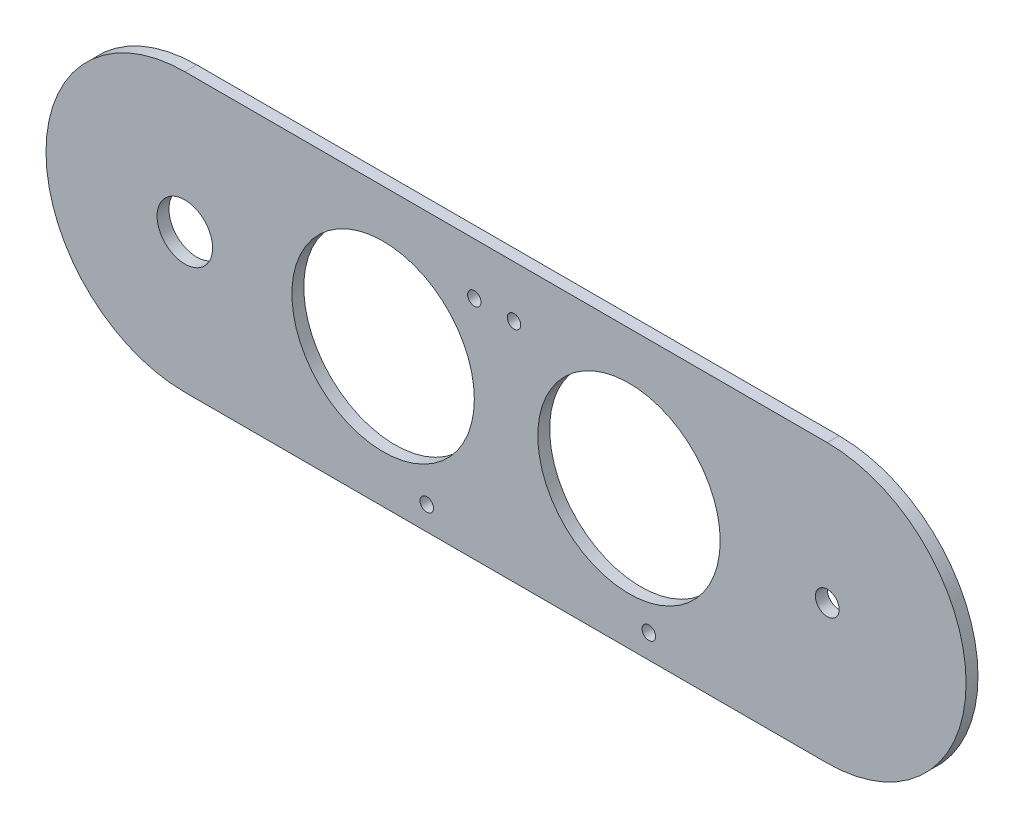
ISO-10303-21;
HEADER;
FILE_DESCRIPTION(('STEP AP214'),'2;1');
FILE_NAME('part.step','',(''),(''),'','','');
FILE_SCHEMA(('AUTOMOTIVE_DESIGN { 1 0 10303 214 1 1 1 1 }'));
ENDSEC;
DATA;
#1=APPLICATION_CONTEXT('core data for automotive mechanical design processes');
#2=APPLICATION_PROTOCOL_DEFINITION('international standard','automotive_design',2000,#1);
#3=PRODUCT_CONTEXT('',#1,'mechanical');
#4=PRODUCT('Part','Part','',(#3));
#5=PRODUCT_RELATED_PRODUCT_CATEGORY('part','',(#4));
#6=PRODUCT_DEFINITION_FORMATION('','',#4);
#7=PRODUCT_DEFINITION_CONTEXT('part definition',#1,'design');
#8=PRODUCT_DEFINITION('design','',#6,#7);
#9=PRODUCT_DEFINITION_SHAPE('','',#8);
#10=(LENGTH_UNIT() NAMED_UNIT(*) SI_UNIT(.MILLI.,.METRE.));
#11=(NAMED_UNIT(*) PLANE_ANGLE_UNIT() SI_UNIT($,.RADIAN.));
#12=(NAMED_UNIT(*) SI_UNIT($,.STERADIAN.) SOLID_ANGLE_UNIT());
#13=UNCERTAINTY_MEASURE_WITH_UNIT(LENGTH_MEASURE(1.E-05),#10,'distance_accuracy_value','');
#14=(GEOMETRIC_REPRESENTATION_CONTEXT(3) GLOBAL_UNCERTAINTY_ASSIGNED_CONTEXT((#13)) GLOBAL_UNIT_ASSIGNED_CONTEXT((#10,
#11,#12)) REPRESENTATION_CONTEXT('',''));
#15=CARTESIAN_POINT('',(0.,0.,0.));
#16=DIRECTION('',(0.,0.,1.));
#17=DIRECTION('',(1.,0.,0.));
#18=AXIS2_PLACEMENT_3D('',#15,#16,#17);
#19=CARTESIAN_POINT('',(-60.5878311258278,15.0430463576159,3.));
#20=DIRECTION('',(0.,0.,1.));
#21=DIRECTION('',(1.,0.,0.));
#22=AXIS2_PLACEMENT_3D('',#19,#20,#21);
#23=PLANE('',#22);
#24=CARTESIAN_POINT('',(56.4121688741722,-13.9569536423841,3.));
#25=DIRECTION('',(0.,0.,1.));
#26=DIRECTION('',(1.,0.,0.));
#27=AXIS2_PLACEMENT_3D('',#24,#25,#26);
#28=CIRCLE('',#27,1.7);
#29=CARTESIAN_POINT('',(58.1121688741722,-13.9569536423841,3.));
#30=VERTEX_POINT('',#29);
#31=EDGE_CURVE('E167',#30,#30,#28,.T.);
#32=ORIENTED_EDGE('',*,*,#31,.F.);
#33=EDGE_LOOP('',(#32));
#34=FACE_BOUND('',#33,.T.);
#35=CARTESIAN_POINT('',(0.41216887417218,-13.9569536423841,3.));
#36=DIRECTION('',(0.,0.,1.));
#37=DIRECTION('',(1.,0.,0.));
#38=AXIS2_PLACEMENT_3D('',#35,#36,#37);
#39=CIRCLE('',#38,1.7);
#40=CARTESIAN_POINT('',(2.11216887417218,-13.9569536423841,3.));
#41=VERTEX_POINT('',#40);
#42=EDGE_CURVE('E168',#41,#41,#39,.T.);
#43=ORIENTED_EDGE('',*,*,#42,.F.);
#44=EDGE_LOOP('',(#43));
#45=FACE_BOUND('',#44,.T.);
#46=CARTESIAN_POINT('',(22.4121688741722,37.0430463576159,3.));
#47=DIRECTION('',(0.,0.,1.));
#48=DIRECTION('',(1.,0.,0.));
#49=AXIS2_PLACEMENT_3D('',#46,#47,#48);
#50=CIRCLE('',#49,1.7);
#51=CARTESIAN_POINT('',(24.1121688741722,37.0430463576159,3.));
#52=VERTEX_POINT('',#51);
#53=EDGE_CURVE('E180',#52,#52,#50,.T.);
#54=ORIENTED_EDGE('',*,*,#53,.F.);
#55=EDGE_LOOP('',(#54));
#56=FACE_BOUND('',#55,.T.);
#57=CARTESIAN_POINT('',(12.4121688741722,37.0430463576159,3.));
#58=DIRECTION('',(0.,0.,1.));
#59=DIRECTION('',(1.,0.,0.));
#60=AXIS2_PLACEMENT_3D('',#57,#58,#59);
#61=CIRCLE('',#60,1.7);
#62=CARTESIAN_POINT('',(14.1121688741722,37.0430463576159,3.));
#63=VERTEX_POINT('',#62);
#64=EDGE_CURVE('E183',#63,#63,#61,.T.);
#65=ORIENTED_EDGE('',*,*,#64,.F.);
#66=EDGE_LOOP('',(#65));
#67=FACE_BOUND('',#66,.T.);
#68=CARTESIAN_POINT('',(51.4121688741722,15.0430463576159,3.));
#69=DIRECTION('',(0.,0.,1.));
#70=DIRECTION('',(1.,0.,0.));
#71=AXIS2_PLACEMENT_3D('',#68,#69,#70);
#72=CIRCLE('',#71,23.);
#73=CARTESIAN_POINT('',(74.4121688741722,15.0430463576159,3.));
#74=VERTEX_POINT('',#73);
#75=EDGE_CURVE('E198',#74,#74,#72,.T.);
#76=ORIENTED_EDGE('',*,*,#75,.F.);
#77=EDGE_LOOP('',(#76));
#78=FACE_BOUND('',#77,.T.);
#79=CARTESIAN_POINT('',(-60.5878311258278,15.0430463576159,3.));
#80=DIRECTION('',(0.,0.,1.));
#81=DIRECTION('',(1.,0.,0.));
#82=AXIS2_PLACEMENT_3D('',#79,#80,#81);
#83=CIRCLE('',#82,7.);
#84=CARTESIAN_POINT('',(-53.5878311258278,15.0430463576159,3.));
#85=VERTEX_POINT('',#84);
#86=EDGE_CURVE('E89',#85,#85,#83,.T.);
#87=ORIENTED_EDGE('',*,*,#86,.F.);
#88=EDGE_LOOP('',(#87));
#89=FACE_BOUND('',#88,.T.);
#90=CARTESIAN_POINT('',(-60.5878311258278,15.0430463576159,3.));
#91=DIRECTION('',(0.,0.,1.));
#92=DIRECTION('',(1.,0.,0.));
#93=AXIS2_PLACEMENT_3D('',#90,#91,#92);
#94=CIRCLE('',#93,35.);
#95=CARTESIAN_POINT('',(-60.5878311258278,50.0430463576159,3.));
#96=VERTEX_POINT('',#95);
#97=CARTESIAN_POINT('',(-60.5878311258278,-19.9569536423841,3.));
#98=VERTEX_POINT('',#97);
#99=EDGE_CURVE('E99',#96,#98,#94,.T.);
#100=ORIENTED_EDGE('',*,*,#99,.T.);
#101=DIRECTION('',(1.,0.,0.));
#102=VECTOR('',#101,1.);
#103=CARTESIAN_POINT('',(-60.5878311258278,-19.9569536423841,3.));
#104=LINE('',#103,#102);
#105=CARTESIAN_POINT('',(101.412168874172,-19.9569536423841,3.));
#106=VERTEX_POINT('',#105);
#107=EDGE_CURVE('E86',#98,#106,#104,.T.);
#108=ORIENTED_EDGE('',*,*,#107,.T.);
#109=CARTESIAN_POINT('',(101.412168874172,15.0430463576159,3.));
#110=DIRECTION('',(0.,0.,-1.));
#111=DIRECTION('',(-1.,0.,0.));
#112=AXIS2_PLACEMENT_3D('',#109,#110,#111);
#113=CIRCLE('',#112,35.);
#114=CARTESIAN_POINT('',(101.412168874172,50.0430463576159,3.));
#115=VERTEX_POINT('',#114);
#116=EDGE_CURVE('E102',#115,#106,#113,.T.);
#117=ORIENTED_EDGE('',*,*,#116,.F.);
#118=DIRECTION('',(1.,0.,0.));
#119=VECTOR('',#118,1.);
#120=CARTESIAN_POINT('',(-60.5878311258278,50.0430463576159,3.));
#121=LINE('',#120,#119);
#122=EDGE_CURVE('E104',#96,#115,#121,.T.);
#123=ORIENTED_EDGE('',*,*,#122,.F.);
#124=EDGE_LOOP('',(#100,#108,#117,#123));
#125=FACE_BOUND('',#124,.T.);
#126=CARTESIAN_POINT('',(101.412168874172,15.0430463576159,3.));
#127=DIRECTION('',(0.,0.,1.));
#128=DIRECTION('',(1.,0.,0.));
#129=AXIS2_PLACEMENT_3D('',#126,#127,#128);
#130=CIRCLE('',#129,3.00000000000001);
#131=CARTESIAN_POINT('',(104.412168874172,15.0430463576159,3.));
#132=VERTEX_POINT('',#131);
#133=EDGE_CURVE('E204',#132,#132,#130,.T.);
#134=ORIENTED_EDGE('',*,*,#133,.F.);
#135=EDGE_LOOP('',(#134));
#136=FACE_BOUND('',#135,.T.);
#137=CARTESIAN_POINT('',(-10.5878311258278,15.0430463576159,3.));
#138=DIRECTION('',(0.,0.,1.));
#139=DIRECTION('',(1.,0.,0.));
#140=AXIS2_PLACEMENT_3D('',#137,#138,#139);
#141=CIRCLE('',#140,23.);
#142=CARTESIAN_POINT('',(12.4121688741722,15.0430463576159,3.));
#143=VERTEX_POINT('',#142);
#144=EDGE_CURVE('E192',#143,#143,#141,.T.);
#145=ORIENTED_EDGE('',*,*,#144,.F.);
#146=EDGE_LOOP('',(#145));
#147=FACE_BOUND('',#146,.T.);
#148=ADVANCED_FACE('F30',(#34,#45,#56,#67,#78,#89,#125,#136,#147),#23,.T.);
#149=CARTESIAN_POINT('',(-60.5878311258278,15.0430463576159,0.));
#150=DIRECTION('',(0.,0.,1.));
#151=DIRECTION('',(1.,0.,0.));
#152=AXIS2_PLACEMENT_3D('',#149,#150,#151);
#153=PLANE('',#152);
#154=CARTESIAN_POINT('',(56.4121688741722,-13.9569536423841,0.));
#155=DIRECTION('',(0.,0.,1.));
#156=DIRECTION('',(1.,0.,0.));
#157=AXIS2_PLACEMENT_3D('',#154,#155,#156);
#158=CIRCLE('',#157,1.7);
#159=CARTESIAN_POINT('',(58.1121688741722,-13.9569536423841,0.));
#160=VERTEX_POINT('',#159);
#161=EDGE_CURVE('E165',#160,#160,#158,.T.);
#162=ORIENTED_EDGE('',*,*,#161,.T.);
#163=EDGE_LOOP('',(#162));
#164=FACE_BOUND('',#163,.T.);
#165=CARTESIAN_POINT('',(0.41216887417218,-13.9569536423841,0.));
#166=DIRECTION('',(0.,0.,1.));
#167=DIRECTION('',(1.,0.,0.));
#168=AXIS2_PLACEMENT_3D('',#165,#166,#167);
#169=CIRCLE('',#168,1.7);
#170=CARTESIAN_POINT('',(2.11216887417218,-13.9569536423841,0.));
#171=VERTEX_POINT('',#170);
#172=EDGE_CURVE('E171',#171,#171,#169,.T.);
#173=ORIENTED_EDGE('',*,*,#172,.T.);
#174=EDGE_LOOP('',(#173));
#175=FACE_BOUND('',#174,.T.);
#176=CARTESIAN_POINT('',(22.4121688741722,37.0430463576159,0.));
#177=DIRECTION('',(0.,0.,1.));
#178=DIRECTION('',(1.,0.,0.));
#179=AXIS2_PLACEMENT_3D('',#176,#177,#178);
#180=CIRCLE('',#179,1.7);
#181=CARTESIAN_POINT('',(24.1121688741722,37.0430463576159,0.));
#182=VERTEX_POINT('',#181);
#183=EDGE_CURVE('E177',#182,#182,#180,.T.);
#184=ORIENTED_EDGE('',*,*,#183,.T.);
#185=EDGE_LOOP('',(#184));
#186=FACE_BOUND('',#185,.T.);
#187=CARTESIAN_POINT('',(12.4121688741722,37.0430463576159,0.));
#188=DIRECTION('',(0.,0.,1.));
#189=DIRECTION('',(1.,0.,0.));
#190=AXIS2_PLACEMENT_3D('',#187,#188,#189);
#191=CIRCLE('',#190,1.7);
#192=CARTESIAN_POINT('',(14.1121688741722,37.0430463576159,0.));
#193=VERTEX_POINT('',#192);
#194=EDGE_CURVE('E186',#193,#193,#191,.T.);
#195=ORIENTED_EDGE('',*,*,#194,.T.);
#196=EDGE_LOOP('',(#195));
#197=FACE_BOUND('',#196,.T.);
#198=CARTESIAN_POINT('',(51.4121688741722,15.0430463576159,0.));
#199=DIRECTION('',(0.,0.,1.));
#200=DIRECTION('',(1.,0.,0.));
#201=AXIS2_PLACEMENT_3D('',#198,#199,#200);
#202=CIRCLE('',#201,23.);
#203=CARTESIAN_POINT('',(74.4121688741722,15.0430463576159,0.));
#204=VERTEX_POINT('',#203);
#205=EDGE_CURVE('E195',#204,#204,#202,.T.);
#206=ORIENTED_EDGE('',*,*,#205,.T.);
#207=EDGE_LOOP('',(#206));
#208=FACE_BOUND('',#207,.T.);
#209=CARTESIAN_POINT('',(-60.5878311258278,15.0430463576159,0.));
#210=DIRECTION('',(0.,0.,1.));
#211=DIRECTION('',(1.,0.,0.));
#212=AXIS2_PLACEMENT_3D('',#209,#210,#211);
#213=CIRCLE('',#212,7.);
#214=CARTESIAN_POINT('',(-53.5878311258278,15.0430463576159,0.));
#215=VERTEX_POINT('',#214);
#216=EDGE_CURVE('E92',#215,#215,#213,.T.);
#217=ORIENTED_EDGE('',*,*,#216,.T.);
#218=EDGE_LOOP('',(#217));
#219=FACE_BOUND('',#218,.T.);
#220=CARTESIAN_POINT('',(-60.5878311258278,15.0430463576159,0.));
#221=DIRECTION('',(0.,0.,1.));
#222=DIRECTION('',(1.,0.,0.));
#223=AXIS2_PLACEMENT_3D('',#220,#221,#222);
#224=CIRCLE('',#223,35.);
#225=CARTESIAN_POINT('',(-60.5878311258278,50.0430463576159,0.));
#226=VERTEX_POINT('',#225);
#227=CARTESIAN_POINT('',(-60.5878311258278,-19.9569536423841,0.));
#228=VERTEX_POINT('',#227);
#229=EDGE_CURVE('E79',#226,#228,#224,.T.);
#230=ORIENTED_EDGE('',*,*,#229,.F.);
#231=DIRECTION('',(1.,0.,0.));
#232=VECTOR('',#231,1.);
#233=CARTESIAN_POINT('',(-60.5878311258278,50.0430463576159,0.));
#234=LINE('',#233,#232);
#235=CARTESIAN_POINT('',(101.412168874172,50.0430463576159,0.));
#236=VERTEX_POINT('',#235);
#237=EDGE_CURVE('E97',#226,#236,#234,.T.);
#238=ORIENTED_EDGE('',*,*,#237,.T.);
#239=CARTESIAN_POINT('',(101.412168874172,15.0430463576159,0.));
#240=DIRECTION('',(0.,0.,-1.));
#241=DIRECTION('',(-1.,0.,0.));
#242=AXIS2_PLACEMENT_3D('',#239,#240,#241);
#243=CIRCLE('',#242,35.);
#244=CARTESIAN_POINT('',(101.412168874172,-19.9569536423841,0.));
#245=VERTEX_POINT('',#244);
#246=EDGE_CURVE('E80',#236,#245,#243,.T.);
#247=ORIENTED_EDGE('',*,*,#246,.T.);
#248=DIRECTION('',(1.,0.,0.));
#249=VECTOR('',#248,1.);
#250=CARTESIAN_POINT('',(-60.5878311258278,-19.9569536423841,0.));
#251=LINE('',#250,#249);
#252=EDGE_CURVE('E74',#228,#245,#251,.T.);
#253=ORIENTED_EDGE('',*,*,#252,.F.);
#254=EDGE_LOOP('',(#230,#238,#247,#253));
#255=FACE_BOUND('',#254,.T.);
#256=CARTESIAN_POINT('',(101.412168874172,15.0430463576159,0.));
#257=DIRECTION('',(0.,0.,1.));
#258=DIRECTION('',(1.,0.,0.));
#259=AXIS2_PLACEMENT_3D('',#256,#257,#258);
#260=CIRCLE('',#259,3.00000000000001);
#261=CARTESIAN_POINT('',(104.412168874172,15.0430463576159,0.));
#262=VERTEX_POINT('',#261);
#263=EDGE_CURVE('E201',#262,#262,#260,.T.);
#264=ORIENTED_EDGE('',*,*,#263,.T.);
#265=EDGE_LOOP('',(#264));
#266=FACE_BOUND('',#265,.T.);
#267=CARTESIAN_POINT('',(-10.5878311258278,15.0430463576159,0.));
#268=DIRECTION('',(0.,0.,1.));
#269=DIRECTION('',(1.,0.,0.));
#270=AXIS2_PLACEMENT_3D('',#267,#268,#269);
#271=CIRCLE('',#270,23.);
#272=CARTESIAN_POINT('',(12.4121688741722,15.0430463576159,0.));
#273=VERTEX_POINT('',#272);
#274=EDGE_CURVE('E189',#273,#273,#271,.T.);
#275=ORIENTED_EDGE('',*,*,#274,.T.);
#276=EDGE_LOOP('',(#275));
#277=FACE_BOUND('',#276,.T.);
#278=ADVANCED_FACE('F75',(#164,#175,#186,#197,#208,#219,#255,#266,#277),#153,.F.);
#279=CARTESIAN_POINT('',(-60.5878311258278,15.0430463576159,3.));
#280=DIRECTION('',(0.,0.,-1.));
#281=DIRECTION('',(-1.,0.,0.));
#282=AXIS2_PLACEMENT_3D('',#279,#280,#281);
#283=CYLINDRICAL_SURFACE('',#282,35.);
#284=ORIENTED_EDGE('',*,*,#229,.T.);
#285=DIRECTION('',(0.,0.,-1.));
#286=VECTOR('',#285,1.);
#287=CARTESIAN_POINT('',(-60.5878311258278,-19.9569536423841,3.));
#288=LINE('',#287,#286);
#289=EDGE_CURVE('E11',#98,#228,#288,.T.);
#290=ORIENTED_EDGE('',*,*,#289,.F.);
#291=ORIENTED_EDGE('',*,*,#99,.F.);
#292=DIRECTION('',(0.,0.,-1.));
#293=VECTOR('',#292,1.);
#294=CARTESIAN_POINT('',(-60.5878311258278,50.0430463576159,3.));
#295=LINE('',#294,#293);
#296=EDGE_CURVE('E45',#96,#226,#295,.T.);
#297=ORIENTED_EDGE('',*,*,#296,.T.);
#298=EDGE_LOOP('',(#284,#290,#291,#297));
#299=FACE_BOUND('',#298,.T.);
#300=ADVANCED_FACE('F32',(#299),#283,.T.);
#301=CARTESIAN_POINT('',(-60.5878311258278,-19.9569536423841,3.));
#302=DIRECTION('',(0.,1.,0.));
#303=DIRECTION('',(0.,0.,1.));
#304=AXIS2_PLACEMENT_3D('',#301,#302,#303);
#305=PLANE('',#304);
#306=ORIENTED_EDGE('',*,*,#252,.T.);
#307=DIRECTION('',(0.,0.,-1.));
#308=VECTOR('',#307,1.);
#309=CARTESIAN_POINT('',(101.412168874172,-19.9569536423841,3.));
#310=LINE('',#309,#308);
#311=EDGE_CURVE('E38',#106,#245,#310,.T.);
#312=ORIENTED_EDGE('',*,*,#311,.F.);
#313=ORIENTED_EDGE('',*,*,#107,.F.);
#314=ORIENTED_EDGE('',*,*,#289,.T.);
#315=EDGE_LOOP('',(#306,#312,#313,#314));
#316=FACE_BOUND('',#315,.T.);
#317=ADVANCED_FACE('F85',(#316),#305,.F.);
#318=CARTESIAN_POINT('',(101.412168874172,15.0430463576159,3.));
#319=DIRECTION('',(0.,0.,-1.));
#320=DIRECTION('',(-1.,0.,0.));
#321=AXIS2_PLACEMENT_3D('',#318,#319,#320);
#322=CYLINDRICAL_SURFACE('',#321,35.);
#323=ORIENTED_EDGE('',*,*,#246,.F.);
#324=DIRECTION('',(0.,0.,-1.));
#325=VECTOR('',#324,1.);
#326=CARTESIAN_POINT('',(101.412168874172,50.0430463576159,3.));
#327=LINE('',#326,#325);
#328=EDGE_CURVE('E53',#115,#236,#327,.T.);
#329=ORIENTED_EDGE('',*,*,#328,.F.);
#330=ORIENTED_EDGE('',*,*,#116,.T.);
#331=ORIENTED_EDGE('',*,*,#311,.T.);
#332=EDGE_LOOP('',(#323,#329,#330,#331));
#333=FACE_BOUND('',#332,.T.);
#334=ADVANCED_FACE('F107',(#333),#322,.T.);
#335=CARTESIAN_POINT('',(-60.5878311258278,50.0430463576159,3.));
#336=DIRECTION('',(0.,1.,0.));
#337=DIRECTION('',(0.,0.,1.));
#338=AXIS2_PLACEMENT_3D('',#335,#336,#337);
#339=PLANE('',#338);
#340=ORIENTED_EDGE('',*,*,#237,.F.);
#341=ORIENTED_EDGE('',*,*,#296,.F.);
#342=ORIENTED_EDGE('',*,*,#122,.T.);
#343=ORIENTED_EDGE('',*,*,#328,.T.);
#344=EDGE_LOOP('',(#340,#341,#342,#343));
#345=FACE_BOUND('',#344,.T.);
#346=ADVANCED_FACE('F111',(#345),#339,.T.);
#347=CARTESIAN_POINT('',(-60.5878311258278,15.0430463576159,3.));
#348=DIRECTION('',(0.,0.,-1.));
#349=DIRECTION('',(-1.,0.,0.));
#350=AXIS2_PLACEMENT_3D('',#347,#348,#349);
#351=CYLINDRICAL_SURFACE('',#350,7.);
#352=ORIENTED_EDGE('',*,*,#86,.T.);
#353=EDGE_LOOP('',(#352));
#354=FACE_BOUND('',#353,.T.);
#355=ORIENTED_EDGE('',*,*,#216,.F.);
#356=EDGE_LOOP('',(#355));
#357=FACE_BOUND('',#356,.T.);
#358=ADVANCED_FACE('F113',(#354,#357),#351,.F.);
#359=CARTESIAN_POINT('',(101.412168874172,15.0430463576159,3.));
#360=DIRECTION('',(0.,0.,-1.));
#361=DIRECTION('',(-1.,0.,0.));
#362=AXIS2_PLACEMENT_3D('',#359,#360,#361);
#363=CYLINDRICAL_SURFACE('',#362,3.00000000000001);
#364=ORIENTED_EDGE('',*,*,#133,.T.);
#365=EDGE_LOOP('',(#364));
#366=FACE_BOUND('',#365,.T.);
#367=ORIENTED_EDGE('',*,*,#263,.F.);
#368=EDGE_LOOP('',(#367));
#369=FACE_BOUND('',#368,.T.);
#370=ADVANCED_FACE('F119',(#366,#369),#363,.F.);
#371=CARTESIAN_POINT('',(51.4121688741722,15.0430463576159,3.));
#372=DIRECTION('',(0.,0.,-1.));
#373=DIRECTION('',(-1.,0.,0.));
#374=AXIS2_PLACEMENT_3D('',#371,#372,#373);
#375=CYLINDRICAL_SURFACE('',#374,23.);
#376=ORIENTED_EDGE('',*,*,#75,.T.);
#377=EDGE_LOOP('',(#376));
#378=FACE_BOUND('',#377,.T.);
#379=ORIENTED_EDGE('',*,*,#205,.F.);
#380=EDGE_LOOP('',(#379));
#381=FACE_BOUND('',#380,.T.);
#382=ADVANCED_FACE('F136',(#378,#381),#375,.F.);
#383=CARTESIAN_POINT('',(-10.5878311258278,15.0430463576159,3.));
#384=DIRECTION('',(0.,0.,-1.));
#385=DIRECTION('',(-1.,0.,0.));
#386=AXIS2_PLACEMENT_3D('',#383,#384,#385);
#387=CYLINDRICAL_SURFACE('',#386,23.);
#388=ORIENTED_EDGE('',*,*,#144,.T.);
#389=EDGE_LOOP('',(#388));
#390=FACE_BOUND('',#389,.T.);
#391=ORIENTED_EDGE('',*,*,#274,.F.);
#392=EDGE_LOOP('',(#391));
#393=FACE_BOUND('',#392,.T.);
#394=ADVANCED_FACE('F140',(#390,#393),#387,.F.);
#395=CARTESIAN_POINT('',(12.4121688741722,37.0430463576159,0.));
#396=DIRECTION('',(0.,0.,1.));
#397=DIRECTION('',(1.,0.,0.));
#398=AXIS2_PLACEMENT_3D('',#395,#396,#397);
#399=CYLINDRICAL_SURFACE('',#398,1.7);
#400=ORIENTED_EDGE('',*,*,#194,.F.);
#401=EDGE_LOOP('',(#400));
#402=FACE_BOUND('',#401,.T.);
#403=ORIENTED_EDGE('',*,*,#64,.T.);
#404=EDGE_LOOP('',(#403));
#405=FACE_BOUND('',#404,.T.);
#406=ADVANCED_FACE('F144',(#402,#405),#399,.F.);
#407=CARTESIAN_POINT('',(22.4121688741722,37.0430463576159,0.));
#408=DIRECTION('',(0.,0.,1.));
#409=DIRECTION('',(1.,0.,0.));
#410=AXIS2_PLACEMENT_3D('',#407,#408,#409);
#411=CYLINDRICAL_SURFACE('',#410,1.7);
#412=ORIENTED_EDGE('',*,*,#183,.F.);
#413=EDGE_LOOP('',(#412));
#414=FACE_BOUND('',#413,.T.);
#415=ORIENTED_EDGE('',*,*,#53,.T.);
#416=EDGE_LOOP('',(#415));
#417=FACE_BOUND('',#416,.T.);
#418=ADVANCED_FACE('F148',(#414,#417),#411,.F.);
#419=CARTESIAN_POINT('',(0.41216887417218,-13.9569536423841,0.));
#420=DIRECTION('',(0.,0.,1.));
#421=DIRECTION('',(1.,0.,0.));
#422=AXIS2_PLACEMENT_3D('',#419,#420,#421);
#423=CYLINDRICAL_SURFACE('',#422,1.7);
#424=ORIENTED_EDGE('',*,*,#172,.F.);
#425=EDGE_LOOP('',(#424));
#426=FACE_BOUND('',#425,.T.);
#427=ORIENTED_EDGE('',*,*,#42,.T.);
#428=EDGE_LOOP('',(#427));
#429=FACE_BOUND('',#428,.T.);
#430=ADVANCED_FACE('F152',(#426,#429),#423,.F.);
#431=CARTESIAN_POINT('',(56.4121688741722,-13.9569536423841,0.));
#432=DIRECTION('',(0.,0.,1.));
#433=DIRECTION('',(1.,0.,0.));
#434=AXIS2_PLACEMENT_3D('',#431,#432,#433);
#435=CYLINDRICAL_SURFACE('',#434,1.7);
#436=ORIENTED_EDGE('',*,*,#161,.F.);
#437=EDGE_LOOP('',(#436));
#438=FACE_BOUND('',#437,.T.);
#439=ORIENTED_EDGE('',*,*,#31,.T.);
#440=EDGE_LOOP('',(#439));
#441=FACE_BOUND('',#440,.T.);
#442=ADVANCED_FACE('F156',(#438,#441),#435,.F.);
#443=CLOSED_SHELL('',(#148,#278,#300,#317,#334,#346,#358,#370,#382,#394,#406,#418,#430,#442));
#444=MANIFOLD_SOLID_BREP('B2',#443);
#445=ADVANCED_BREP_SHAPE_REPRESENTATION('',(#18,#444),#14);
#446=SHAPE_DEFINITION_REPRESENTATION(#9,#445);
ENDSEC;
END-ISO-10303-21;
